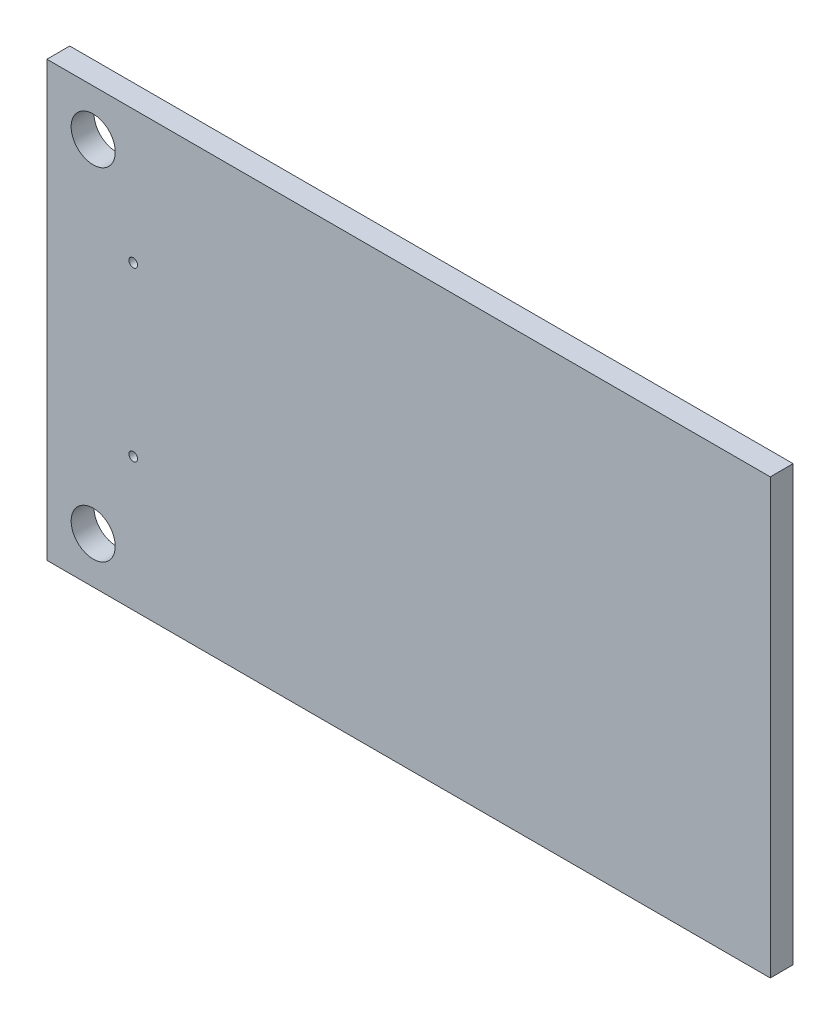
ISO-10303-21;
HEADER;
FILE_DESCRIPTION(('STEP AP214'),'2;1');
FILE_NAME('part.step','',(''),(''),'','','');
FILE_SCHEMA(('AUTOMOTIVE_DESIGN { 1 0 10303 214 1 1 1 1 }'));
ENDSEC;
DATA;
#1=APPLICATION_CONTEXT('core data for automotive mechanical design processes');
#2=APPLICATION_PROTOCOL_DEFINITION('international standard','automotive_design',2000,#1);
#3=PRODUCT_CONTEXT('',#1,'mechanical');
#4=PRODUCT('Part','Part','',(#3));
#5=PRODUCT_RELATED_PRODUCT_CATEGORY('part','',(#4));
#6=PRODUCT_DEFINITION_FORMATION('','',#4);
#7=PRODUCT_DEFINITION_CONTEXT('part definition',#1,'design');
#8=PRODUCT_DEFINITION('design','',#6,#7);
#9=PRODUCT_DEFINITION_SHAPE('','',#8);
#10=(LENGTH_UNIT() NAMED_UNIT(*) SI_UNIT(.MILLI.,.METRE.));
#11=(NAMED_UNIT(*) PLANE_ANGLE_UNIT() SI_UNIT($,.RADIAN.));
#12=(NAMED_UNIT(*) SI_UNIT($,.STERADIAN.) SOLID_ANGLE_UNIT());
#13=UNCERTAINTY_MEASURE_WITH_UNIT(LENGTH_MEASURE(1.E-05),#10,'distance_accuracy_value','');
#14=(GEOMETRIC_REPRESENTATION_CONTEXT(3) GLOBAL_UNCERTAINTY_ASSIGNED_CONTEXT((#13)) GLOBAL_UNIT_ASSIGNED_CONTEXT((#10,
#11,#12)) REPRESENTATION_CONTEXT('',''));
#15=CARTESIAN_POINT('',(0.,0.,0.));
#16=DIRECTION('',(0.,0.,1.));
#17=DIRECTION('',(1.,0.,0.));
#18=AXIS2_PLACEMENT_3D('',#15,#16,#17);
#19=CARTESIAN_POINT('',(0.,0.,1.58));
#20=DIRECTION('',(0.,0.,1.));
#21=DIRECTION('',(1.,0.,0.));
#22=AXIS2_PLACEMENT_3D('',#19,#20,#21);
#23=PLANE('',#22);
#24=CARTESIAN_POINT('',(-19.032,5.8,1.58));
#25=DIRECTION('',(0.,0.,1.));
#26=DIRECTION('',(1.,0.,0.));
#27=AXIS2_PLACEMENT_3D('',#24,#25,#26);
#28=CIRCLE('',#27,0.3);
#29=CARTESIAN_POINT('',(-18.732,5.8,1.58));
#30=VERTEX_POINT('',#29);
#31=EDGE_CURVE('E120',#30,#30,#28,.T.);
#32=ORIENTED_EDGE('',*,*,#31,.F.);
#33=EDGE_LOOP('',(#32));
#34=FACE_BOUND('',#33,.T.);
#35=CARTESIAN_POINT('',(-21.8,11.8,1.58));
#36=DIRECTION('',(0.,0.,1.));
#37=DIRECTION('',(1.,0.,0.));
#38=AXIS2_PLACEMENT_3D('',#35,#36,#37);
#39=CIRCLE('',#38,1.524);
#40=CARTESIAN_POINT('',(-23.324,11.8,1.58));
#41=VERTEX_POINT('',#40);
#42=EDGE_CURVE('E99',#41,#41,#39,.T.);
#43=ORIENTED_EDGE('',*,*,#42,.F.);
#44=EDGE_LOOP('',(#43));
#45=FACE_BOUND('',#44,.T.);
#46=DIRECTION('',(0.,1.,0.));
#47=VECTOR('',#46,1.);
#48=CARTESIAN_POINT('',(25.,15.,1.58));
#49=LINE('',#48,#47);
#50=CARTESIAN_POINT('',(25.,-15.,1.58));
#51=VERTEX_POINT('',#50);
#52=CARTESIAN_POINT('',(25.,15.,1.58));
#53=VERTEX_POINT('',#52);
#54=EDGE_CURVE('E84',#51,#53,#49,.T.);
#55=ORIENTED_EDGE('',*,*,#54,.T.);
#56=DIRECTION('',(-1.,0.,0.));
#57=VECTOR('',#56,1.);
#58=CARTESIAN_POINT('',(-25.,15.,1.58));
#59=LINE('',#58,#57);
#60=CARTESIAN_POINT('',(-25.,15.,1.58));
#61=VERTEX_POINT('',#60);
#62=EDGE_CURVE('E79',#53,#61,#59,.T.);
#63=ORIENTED_EDGE('',*,*,#62,.T.);
#64=DIRECTION('',(0.,-1.,0.));
#65=VECTOR('',#64,1.);
#66=CARTESIAN_POINT('',(-25.,15.,1.58));
#67=LINE('',#66,#65);
#68=CARTESIAN_POINT('',(-25.,-15.,1.58));
#69=VERTEX_POINT('',#68);
#70=EDGE_CURVE('E82',#61,#69,#67,.T.);
#71=ORIENTED_EDGE('',*,*,#70,.T.);
#72=DIRECTION('',(1.,0.,0.));
#73=VECTOR('',#72,1.);
#74=CARTESIAN_POINT('',(-25.,-15.,1.58));
#75=LINE('',#74,#73);
#76=EDGE_CURVE('E49',#69,#51,#75,.T.);
#77=ORIENTED_EDGE('',*,*,#76,.T.);
#78=EDGE_LOOP('',(#55,#63,#71,#77));
#79=FACE_BOUND('',#78,.T.);
#80=CARTESIAN_POINT('',(-21.8,-11.8,1.58));
#81=DIRECTION('',(0.,0.,1.));
#82=DIRECTION('',(1.,0.,0.));
#83=AXIS2_PLACEMENT_3D('',#80,#81,#82);
#84=CIRCLE('',#83,1.524);
#85=CARTESIAN_POINT('',(-23.324,-11.8,1.58));
#86=VERTEX_POINT('',#85);
#87=EDGE_CURVE('E114',#86,#86,#84,.T.);
#88=ORIENTED_EDGE('',*,*,#87,.F.);
#89=EDGE_LOOP('',(#88));
#90=FACE_BOUND('',#89,.T.);
#91=CARTESIAN_POINT('',(-19.032,-5.8,1.58));
#92=DIRECTION('',(0.,0.,1.));
#93=DIRECTION('',(1.,0.,0.));
#94=AXIS2_PLACEMENT_3D('',#91,#92,#93);
#95=CIRCLE('',#94,0.3);
#96=CARTESIAN_POINT('',(-18.732,-5.8,1.58));
#97=VERTEX_POINT('',#96);
#98=EDGE_CURVE('E126',#97,#97,#95,.T.);
#99=ORIENTED_EDGE('',*,*,#98,.F.);
#100=EDGE_LOOP('',(#99));
#101=FACE_BOUND('',#100,.T.);
#102=ADVANCED_FACE('F32',(#34,#45,#79,#90,#101),#23,.T.);
#103=CARTESIAN_POINT('',(0.,0.,0.));
#104=DIRECTION('',(0.,0.,1.));
#105=DIRECTION('',(1.,0.,0.));
#106=AXIS2_PLACEMENT_3D('',#103,#104,#105);
#107=PLANE('',#106);
#108=DIRECTION('',(0.,1.,0.));
#109=VECTOR('',#108,1.);
#110=CARTESIAN_POINT('',(25.,15.,0.));
#111=LINE('',#110,#109);
#112=CARTESIAN_POINT('',(25.,-15.,0.));
#113=VERTEX_POINT('',#112);
#114=CARTESIAN_POINT('',(25.,15.,0.));
#115=VERTEX_POINT('',#114);
#116=EDGE_CURVE('E96',#113,#115,#111,.T.);
#117=ORIENTED_EDGE('',*,*,#116,.F.);
#118=DIRECTION('',(1.,0.,0.));
#119=VECTOR('',#118,1.);
#120=CARTESIAN_POINT('',(-25.,-15.,0.));
#121=LINE('',#120,#119);
#122=CARTESIAN_POINT('',(-25.,-15.,0.));
#123=VERTEX_POINT('',#122);
#124=EDGE_CURVE('E72',#123,#113,#121,.T.);
#125=ORIENTED_EDGE('',*,*,#124,.F.);
#126=DIRECTION('',(0.,-1.,0.));
#127=VECTOR('',#126,1.);
#128=CARTESIAN_POINT('',(-25.,15.,0.));
#129=LINE('',#128,#127);
#130=CARTESIAN_POINT('',(-25.,15.,0.));
#131=VERTEX_POINT('',#130);
#132=EDGE_CURVE('E66',#131,#123,#129,.T.);
#133=ORIENTED_EDGE('',*,*,#132,.F.);
#134=DIRECTION('',(-1.,0.,0.));
#135=VECTOR('',#134,1.);
#136=CARTESIAN_POINT('',(-25.,15.,0.));
#137=LINE('',#136,#135);
#138=EDGE_CURVE('E88',#115,#131,#137,.T.);
#139=ORIENTED_EDGE('',*,*,#138,.F.);
#140=EDGE_LOOP('',(#117,#125,#133,#139));
#141=FACE_BOUND('',#140,.T.);
#142=CARTESIAN_POINT('',(-21.8,11.8,0.));
#143=DIRECTION('',(0.,0.,1.));
#144=DIRECTION('',(1.,0.,0.));
#145=AXIS2_PLACEMENT_3D('',#142,#143,#144);
#146=CIRCLE('',#145,1.524);
#147=CARTESIAN_POINT('',(-23.324,11.8,0.));
#148=VERTEX_POINT('',#147);
#149=EDGE_CURVE('E111',#148,#148,#146,.T.);
#150=ORIENTED_EDGE('',*,*,#149,.T.);
#151=EDGE_LOOP('',(#150));
#152=FACE_BOUND('',#151,.T.);
#153=CARTESIAN_POINT('',(-21.8,-11.8,0.));
#154=DIRECTION('',(0.,0.,1.));
#155=DIRECTION('',(1.,0.,0.));
#156=AXIS2_PLACEMENT_3D('',#153,#154,#155);
#157=CIRCLE('',#156,1.524);
#158=CARTESIAN_POINT('',(-23.324,-11.8,0.));
#159=VERTEX_POINT('',#158);
#160=EDGE_CURVE('E117',#159,#159,#157,.T.);
#161=ORIENTED_EDGE('',*,*,#160,.T.);
#162=EDGE_LOOP('',(#161));
#163=FACE_BOUND('',#162,.T.);
#164=CARTESIAN_POINT('',(-19.032,5.8,0.));
#165=DIRECTION('',(0.,0.,1.));
#166=DIRECTION('',(1.,0.,0.));
#167=AXIS2_PLACEMENT_3D('',#164,#165,#166);
#168=CIRCLE('',#167,0.3);
#169=CARTESIAN_POINT('',(-18.732,5.8,0.));
#170=VERTEX_POINT('',#169);
#171=EDGE_CURVE('E123',#170,#170,#168,.T.);
#172=ORIENTED_EDGE('',*,*,#171,.T.);
#173=EDGE_LOOP('',(#172));
#174=FACE_BOUND('',#173,.T.);
#175=CARTESIAN_POINT('',(-19.032,-5.8,0.));
#176=DIRECTION('',(0.,0.,1.));
#177=DIRECTION('',(1.,0.,0.));
#178=AXIS2_PLACEMENT_3D('',#175,#176,#177);
#179=CIRCLE('',#178,0.3);
#180=CARTESIAN_POINT('',(-18.732,-5.8,0.));
#181=VERTEX_POINT('',#180);
#182=EDGE_CURVE('E129',#181,#181,#179,.T.);
#183=ORIENTED_EDGE('',*,*,#182,.T.);
#184=EDGE_LOOP('',(#183));
#185=FACE_BOUND('',#184,.T.);
#186=ADVANCED_FACE('F107',(#141,#152,#163,#174,#185),#107,.F.);
#187=CARTESIAN_POINT('',(25.,15.,1.58));
#188=DIRECTION('',(-1.,0.,0.));
#189=DIRECTION('',(0.,0.,1.));
#190=AXIS2_PLACEMENT_3D('',#187,#188,#189);
#191=PLANE('',#190);
#192=ORIENTED_EDGE('',*,*,#116,.T.);
#193=DIRECTION('',(0.,0.,-1.));
#194=VECTOR('',#193,1.);
#195=CARTESIAN_POINT('',(25.,15.,1.58));
#196=LINE('',#195,#194);
#197=EDGE_CURVE('E11',#53,#115,#196,.T.);
#198=ORIENTED_EDGE('',*,*,#197,.F.);
#199=ORIENTED_EDGE('',*,*,#54,.F.);
#200=DIRECTION('',(0.,0.,-1.));
#201=VECTOR('',#200,1.);
#202=CARTESIAN_POINT('',(25.,-15.,1.58));
#203=LINE('',#202,#201);
#204=EDGE_CURVE('E92',#51,#113,#203,.T.);
#205=ORIENTED_EDGE('',*,*,#204,.T.);
#206=EDGE_LOOP('',(#192,#198,#199,#205));
#207=FACE_BOUND('',#206,.T.);
#208=ADVANCED_FACE('F34',(#207),#191,.F.);
#209=CARTESIAN_POINT('',(-25.,15.,1.58));
#210=DIRECTION('',(0.,-1.,0.));
#211=DIRECTION('',(0.,0.,-1.));
#212=AXIS2_PLACEMENT_3D('',#209,#210,#211);
#213=PLANE('',#212);
#214=ORIENTED_EDGE('',*,*,#138,.T.);
#215=DIRECTION('',(0.,0.,-1.));
#216=VECTOR('',#215,1.);
#217=CARTESIAN_POINT('',(-25.,15.,1.58));
#218=LINE('',#217,#216);
#219=EDGE_CURVE('E41',#61,#131,#218,.T.);
#220=ORIENTED_EDGE('',*,*,#219,.F.);
#221=ORIENTED_EDGE('',*,*,#62,.F.);
#222=ORIENTED_EDGE('',*,*,#197,.T.);
#223=EDGE_LOOP('',(#214,#220,#221,#222));
#224=FACE_BOUND('',#223,.T.);
#225=ADVANCED_FACE('F87',(#224),#213,.F.);
#226=CARTESIAN_POINT('',(-25.,15.,1.58));
#227=DIRECTION('',(1.,0.,0.));
#228=DIRECTION('',(0.,0.,-1.));
#229=AXIS2_PLACEMENT_3D('',#226,#227,#228);
#230=PLANE('',#229);
#231=ORIENTED_EDGE('',*,*,#132,.T.);
#232=DIRECTION('',(0.,0.,-1.));
#233=VECTOR('',#232,1.);
#234=CARTESIAN_POINT('',(-25.,-15.,1.58));
#235=LINE('',#234,#233);
#236=EDGE_CURVE('E89',#69,#123,#235,.T.);
#237=ORIENTED_EDGE('',*,*,#236,.F.);
#238=ORIENTED_EDGE('',*,*,#70,.F.);
#239=ORIENTED_EDGE('',*,*,#219,.T.);
#240=EDGE_LOOP('',(#231,#237,#238,#239));
#241=FACE_BOUND('',#240,.T.);
#242=ADVANCED_FACE('F90',(#241),#230,.F.);
#243=CARTESIAN_POINT('',(-25.,-15.,1.58));
#244=DIRECTION('',(0.,1.,0.));
#245=DIRECTION('',(0.,0.,1.));
#246=AXIS2_PLACEMENT_3D('',#243,#244,#245);
#247=PLANE('',#246);
#248=ORIENTED_EDGE('',*,*,#124,.T.);
#249=ORIENTED_EDGE('',*,*,#204,.F.);
#250=ORIENTED_EDGE('',*,*,#76,.F.);
#251=ORIENTED_EDGE('',*,*,#236,.T.);
#252=EDGE_LOOP('',(#248,#249,#250,#251));
#253=FACE_BOUND('',#252,.T.);
#254=ADVANCED_FACE('F104',(#253),#247,.F.);
#255=CARTESIAN_POINT('',(-21.8,11.8,1.58));
#256=DIRECTION('',(0.,0.,-1.));
#257=DIRECTION('',(-1.,0.,0.));
#258=AXIS2_PLACEMENT_3D('',#255,#256,#257);
#259=CYLINDRICAL_SURFACE('',#258,1.524);
#260=CARTESIAN_POINT('',(-23.324,11.8,1.58));
#261=CARTESIAN_POINT('',(-23.324,11.8,1.56354166666667));
#262=CARTESIAN_POINT('',(-23.324,11.8,1.54708333333333));
#263=CARTESIAN_POINT('',(-23.324,11.8,1.51416666666667));
#264=CARTESIAN_POINT('',(-23.324,11.8,1.49770833333333));
#265=CARTESIAN_POINT('',(-23.324,11.8,1.46479166666667));
#266=CARTESIAN_POINT('',(-23.324,11.8,1.44833333333333));
#267=CARTESIAN_POINT('',(-23.324,11.8,1.41541666666667));
#268=CARTESIAN_POINT('',(-23.324,11.8,1.39895833333333));
#269=CARTESIAN_POINT('',(-23.324,11.8,1.36604166666667));
#270=CARTESIAN_POINT('',(-23.324,11.8,1.34958333333333));
#271=CARTESIAN_POINT('',(-23.324,11.8,1.31666666666667));
#272=CARTESIAN_POINT('',(-23.324,11.8,1.30020833333333));
#273=CARTESIAN_POINT('',(-23.324,11.8,1.26729166666667));
#274=CARTESIAN_POINT('',(-23.324,11.8,1.25083333333333));
#275=CARTESIAN_POINT('',(-23.324,11.8,1.21791666666667));
#276=CARTESIAN_POINT('',(-23.324,11.8,1.20145833333333));
#277=CARTESIAN_POINT('',(-23.324,11.8,1.16854166666667));
#278=CARTESIAN_POINT('',(-23.324,11.8,1.15208333333333));
#279=CARTESIAN_POINT('',(-23.324,11.8,1.11916666666667));
#280=CARTESIAN_POINT('',(-23.324,11.8,1.10270833333333));
#281=CARTESIAN_POINT('',(-23.324,11.8,1.06979166666667));
#282=CARTESIAN_POINT('',(-23.324,11.8,1.05333333333333));
#283=CARTESIAN_POINT('',(-23.324,11.8,1.02041666666667));
#284=CARTESIAN_POINT('',(-23.324,11.8,1.00395833333333));
#285=CARTESIAN_POINT('',(-23.324,11.8,0.971041666666667));
#286=CARTESIAN_POINT('',(-23.324,11.8,0.954583333333333));
#287=CARTESIAN_POINT('',(-23.324,11.8,0.921666666666667));
#288=CARTESIAN_POINT('',(-23.324,11.8,0.905208333333333));
#289=CARTESIAN_POINT('',(-23.324,11.8,0.872291666666667));
#290=CARTESIAN_POINT('',(-23.324,11.8,0.855833333333333));
#291=CARTESIAN_POINT('',(-23.324,11.8,0.822916666666667));
#292=CARTESIAN_POINT('',(-23.324,11.8,0.806458333333333));
#293=CARTESIAN_POINT('',(-23.324,11.8,0.773541666666667));
#294=CARTESIAN_POINT('',(-23.324,11.8,0.757083333333333));
#295=CARTESIAN_POINT('',(-23.324,11.8,0.724166666666667));
#296=CARTESIAN_POINT('',(-23.324,11.8,0.707708333333333));
#297=CARTESIAN_POINT('',(-23.324,11.8,0.674791666666667));
#298=CARTESIAN_POINT('',(-23.324,11.8,0.658333333333333));
#299=CARTESIAN_POINT('',(-23.324,11.8,0.625416666666667));
#300=CARTESIAN_POINT('',(-23.324,11.8,0.608958333333333));
#301=CARTESIAN_POINT('',(-23.324,11.8,0.576041666666667));
#302=CARTESIAN_POINT('',(-23.324,11.8,0.559583333333333));
#303=CARTESIAN_POINT('',(-23.324,11.8,0.526666666666667));
#304=CARTESIAN_POINT('',(-23.324,11.8,0.510208333333333));
#305=CARTESIAN_POINT('',(-23.324,11.8,0.477291666666667));
#306=CARTESIAN_POINT('',(-23.324,11.8,0.460833333333333));
#307=CARTESIAN_POINT('',(-23.324,11.8,0.427916666666667));
#308=CARTESIAN_POINT('',(-23.324,11.8,0.411458333333333));
#309=CARTESIAN_POINT('',(-23.324,11.8,0.378541666666667));
#310=CARTESIAN_POINT('',(-23.324,11.8,0.362083333333333));
#311=CARTESIAN_POINT('',(-23.324,11.8,0.329166666666667));
#312=CARTESIAN_POINT('',(-23.324,11.8,0.312708333333333));
#313=CARTESIAN_POINT('',(-23.324,11.8,0.279791666666667));
#314=CARTESIAN_POINT('',(-23.324,11.8,0.263333333333333));
#315=CARTESIAN_POINT('',(-23.324,11.8,0.230416666666667));
#316=CARTESIAN_POINT('',(-23.324,11.8,0.213958333333333));
#317=CARTESIAN_POINT('',(-23.324,11.8,0.181041666666667));
#318=CARTESIAN_POINT('',(-23.324,11.8,0.164583333333333));
#319=CARTESIAN_POINT('',(-23.324,11.8,0.131666666666667));
#320=CARTESIAN_POINT('',(-23.324,11.8,0.115208333333333));
#321=CARTESIAN_POINT('',(-23.324,11.8,0.0822916666666667));
#322=CARTESIAN_POINT('',(-23.324,11.8,0.0658333333333333));
#323=CARTESIAN_POINT('',(-23.324,11.8,0.0329166666666666));
#324=CARTESIAN_POINT('',(-23.324,11.8,0.0164583333333333));
#325=CARTESIAN_POINT('',(-23.324,11.8,0.));
#326=B_SPLINE_CURVE_WITH_KNOTS('',3,(#260,#261,#262,#263,#264,#265,#266,#267,#268,#269,#270,
#271,#272,#273,#274,#275,#276,#277,#278,#279,#280,#281,#282,#283,#284,#285,#286,#287,#288,#289,
#290,#291,#292,#293,#294,#295,#296,#297,#298,#299,#300,#301,#302,#303,#304,#305,#306,#307,#308,
#309,#310,#311,#312,#313,#314,#315,#316,#317,#318,#319,#320,#321,#322,#323,#324,#325),
.UNSPECIFIED.,.F.,.F.,(4,2,2,2,2,2,2,2,2,2,2,2,2,2,2,2,2,2,2,2,2,2,2,2,2,2,2,2,2,2,2,2,4),(0.,
0.0493750000000002,0.0987500000000001,0.148125,0.1975,0.246875,0.29625,0.345625,0.395,0.444375,
0.49375,0.543125,0.5925,0.641875,0.69125,0.740625,0.79,0.839375,0.88875,0.938125,0.9875,
1.036875,1.08625,1.135625,1.185,1.234375,1.28375,1.333125,1.3825,1.431875,1.48125,1.530625,
1.58),.UNSPECIFIED.);
#327=EDGE_CURVE('BSEAM148',#41,#148,#326,.T.);
#328=ORIENTED_EDGE('',*,*,#42,.T.);
#329=ORIENTED_EDGE('',*,*,#149,.F.);
#330=ORIENTED_EDGE('',*,*,#327,.T.);
#331=ORIENTED_EDGE('',*,*,#327,.F.);
#332=EDGE_LOOP('',(#328,#330,#329,#331));
#333=FACE_BOUND('',#332,.T.);
#334=ADVANCED_FACE('F148',(#333),#259,.F.);
#335=CARTESIAN_POINT('',(-21.8,-11.8,1.58));
#336=DIRECTION('',(0.,0.,-1.));
#337=DIRECTION('',(-1.,0.,0.));
#338=AXIS2_PLACEMENT_3D('',#335,#336,#337);
#339=CYLINDRICAL_SURFACE('',#338,1.524);
#340=CARTESIAN_POINT('',(-23.324,-11.8,1.58));
#341=CARTESIAN_POINT('',(-23.324,-11.8,1.56354166666667));
#342=CARTESIAN_POINT('',(-23.324,-11.8,1.54708333333333));
#343=CARTESIAN_POINT('',(-23.324,-11.8,1.51416666666667));
#344=CARTESIAN_POINT('',(-23.324,-11.8,1.49770833333333));
#345=CARTESIAN_POINT('',(-23.324,-11.8,1.46479166666667));
#346=CARTESIAN_POINT('',(-23.324,-11.8,1.44833333333333));
#347=CARTESIAN_POINT('',(-23.324,-11.8,1.41541666666667));
#348=CARTESIAN_POINT('',(-23.324,-11.8,1.39895833333333));
#349=CARTESIAN_POINT('',(-23.324,-11.8,1.36604166666667));
#350=CARTESIAN_POINT('',(-23.324,-11.8,1.34958333333333));
#351=CARTESIAN_POINT('',(-23.324,-11.8,1.31666666666667));
#352=CARTESIAN_POINT('',(-23.324,-11.8,1.30020833333333));
#353=CARTESIAN_POINT('',(-23.324,-11.8,1.26729166666667));
#354=CARTESIAN_POINT('',(-23.324,-11.8,1.25083333333333));
#355=CARTESIAN_POINT('',(-23.324,-11.8,1.21791666666667));
#356=CARTESIAN_POINT('',(-23.324,-11.8,1.20145833333333));
#357=CARTESIAN_POINT('',(-23.324,-11.8,1.16854166666667));
#358=CARTESIAN_POINT('',(-23.324,-11.8,1.15208333333333));
#359=CARTESIAN_POINT('',(-23.324,-11.8,1.11916666666667));
#360=CARTESIAN_POINT('',(-23.324,-11.8,1.10270833333333));
#361=CARTESIAN_POINT('',(-23.324,-11.8,1.06979166666667));
#362=CARTESIAN_POINT('',(-23.324,-11.8,1.05333333333333));
#363=CARTESIAN_POINT('',(-23.324,-11.8,1.02041666666667));
#364=CARTESIAN_POINT('',(-23.324,-11.8,1.00395833333333));
#365=CARTESIAN_POINT('',(-23.324,-11.8,0.971041666666667));
#366=CARTESIAN_POINT('',(-23.324,-11.8,0.954583333333333));
#367=CARTESIAN_POINT('',(-23.324,-11.8,0.921666666666667));
#368=CARTESIAN_POINT('',(-23.324,-11.8,0.905208333333333));
#369=CARTESIAN_POINT('',(-23.324,-11.8,0.872291666666667));
#370=CARTESIAN_POINT('',(-23.324,-11.8,0.855833333333333));
#371=CARTESIAN_POINT('',(-23.324,-11.8,0.822916666666667));
#372=CARTESIAN_POINT('',(-23.324,-11.8,0.806458333333333));
#373=CARTESIAN_POINT('',(-23.324,-11.8,0.773541666666667));
#374=CARTESIAN_POINT('',(-23.324,-11.8,0.757083333333333));
#375=CARTESIAN_POINT('',(-23.324,-11.8,0.724166666666667));
#376=CARTESIAN_POINT('',(-23.324,-11.8,0.707708333333333));
#377=CARTESIAN_POINT('',(-23.324,-11.8,0.674791666666667));
#378=CARTESIAN_POINT('',(-23.324,-11.8,0.658333333333333));
#379=CARTESIAN_POINT('',(-23.324,-11.8,0.625416666666667));
#380=CARTESIAN_POINT('',(-23.324,-11.8,0.608958333333333));
#381=CARTESIAN_POINT('',(-23.324,-11.8,0.576041666666667));
#382=CARTESIAN_POINT('',(-23.324,-11.8,0.559583333333333));
#383=CARTESIAN_POINT('',(-23.324,-11.8,0.526666666666667));
#384=CARTESIAN_POINT('',(-23.324,-11.8,0.510208333333333));
#385=CARTESIAN_POINT('',(-23.324,-11.8,0.477291666666667));
#386=CARTESIAN_POINT('',(-23.324,-11.8,0.460833333333333));
#387=CARTESIAN_POINT('',(-23.324,-11.8,0.427916666666667));
#388=CARTESIAN_POINT('',(-23.324,-11.8,0.411458333333333));
#389=CARTESIAN_POINT('',(-23.324,-11.8,0.378541666666667));
#390=CARTESIAN_POINT('',(-23.324,-11.8,0.362083333333333));
#391=CARTESIAN_POINT('',(-23.324,-11.8,0.329166666666667));
#392=CARTESIAN_POINT('',(-23.324,-11.8,0.312708333333333));
#393=CARTESIAN_POINT('',(-23.324,-11.8,0.279791666666667));
#394=CARTESIAN_POINT('',(-23.324,-11.8,0.263333333333333));
#395=CARTESIAN_POINT('',(-23.324,-11.8,0.230416666666667));
#396=CARTESIAN_POINT('',(-23.324,-11.8,0.213958333333333));
#397=CARTESIAN_POINT('',(-23.324,-11.8,0.181041666666667));
#398=CARTESIAN_POINT('',(-23.324,-11.8,0.164583333333333));
#399=CARTESIAN_POINT('',(-23.324,-11.8,0.131666666666667));
#400=CARTESIAN_POINT('',(-23.324,-11.8,0.115208333333333));
#401=CARTESIAN_POINT('',(-23.324,-11.8,0.0822916666666667));
#402=CARTESIAN_POINT('',(-23.324,-11.8,0.0658333333333333));
#403=CARTESIAN_POINT('',(-23.324,-11.8,0.0329166666666666));
#404=CARTESIAN_POINT('',(-23.324,-11.8,0.0164583333333333));
#405=CARTESIAN_POINT('',(-23.324,-11.8,0.));
#406=B_SPLINE_CURVE_WITH_KNOTS('',3,(#340,#341,#342,#343,#344,#345,#346,#347,#348,#349,#350,
#351,#352,#353,#354,#355,#356,#357,#358,#359,#360,#361,#362,#363,#364,#365,#366,#367,#368,#369,
#370,#371,#372,#373,#374,#375,#376,#377,#378,#379,#380,#381,#382,#383,#384,#385,#386,#387,#388,
#389,#390,#391,#392,#393,#394,#395,#396,#397,#398,#399,#400,#401,#402,#403,#404,#405),
.UNSPECIFIED.,.F.,.F.,(4,2,2,2,2,2,2,2,2,2,2,2,2,2,2,2,2,2,2,2,2,2,2,2,2,2,2,2,2,2,2,2,4),(0.,
0.0493750000000002,0.0987500000000001,0.148125,0.1975,0.246875,0.29625,0.345625,0.395,0.444375,
0.49375,0.543125,0.5925,0.641875,0.69125,0.740625,0.79,0.839375,0.88875,0.938125,0.9875,
1.036875,1.08625,1.135625,1.185,1.234375,1.28375,1.333125,1.3825,1.431875,1.48125,1.530625,
1.58),.UNSPECIFIED.);
#407=EDGE_CURVE('BSEAM194',#86,#159,#406,.T.);
#408=ORIENTED_EDGE('',*,*,#87,.T.);
#409=ORIENTED_EDGE('',*,*,#160,.F.);
#410=ORIENTED_EDGE('',*,*,#407,.T.);
#411=ORIENTED_EDGE('',*,*,#407,.F.);
#412=EDGE_LOOP('',(#408,#410,#409,#411));
#413=FACE_BOUND('',#412,.T.);
#414=ADVANCED_FACE('F194',(#413),#339,.F.);
#415=CARTESIAN_POINT('',(-19.032,5.8,1.58));
#416=DIRECTION('',(0.,0.,-1.));
#417=DIRECTION('',(-1.,0.,0.));
#418=AXIS2_PLACEMENT_3D('',#415,#416,#417);
#419=CYLINDRICAL_SURFACE('',#418,0.3);
#420=ORIENTED_EDGE('',*,*,#31,.T.);
#421=EDGE_LOOP('',(#420));
#422=FACE_BOUND('',#421,.T.);
#423=ORIENTED_EDGE('',*,*,#171,.F.);
#424=EDGE_LOOP('',(#423));
#425=FACE_BOUND('',#424,.T.);
#426=ADVANCED_FACE('F202',(#422,#425),#419,.F.);
#427=CARTESIAN_POINT('',(-19.032,-5.8,1.58));
#428=DIRECTION('',(0.,0.,-1.));
#429=DIRECTION('',(-1.,0.,0.));
#430=AXIS2_PLACEMENT_3D('',#427,#428,#429);
#431=CYLINDRICAL_SURFACE('',#430,0.3);
#432=ORIENTED_EDGE('',*,*,#98,.T.);
#433=EDGE_LOOP('',(#432));
#434=FACE_BOUND('',#433,.T.);
#435=ORIENTED_EDGE('',*,*,#182,.F.);
#436=EDGE_LOOP('',(#435));
#437=FACE_BOUND('',#436,.T.);
#438=ADVANCED_FACE('F135',(#434,#437),#431,.F.);
#439=CLOSED_SHELL('',(#102,#186,#208,#225,#242,#254,#334,#414,#426,#438));
#440=MANIFOLD_SOLID_BREP('B2',#439);
#441=ADVANCED_BREP_SHAPE_REPRESENTATION('',(#18,#440),#14);
#442=SHAPE_DEFINITION_REPRESENTATION(#9,#441);
ENDSEC;
END-ISO-10303-21;
